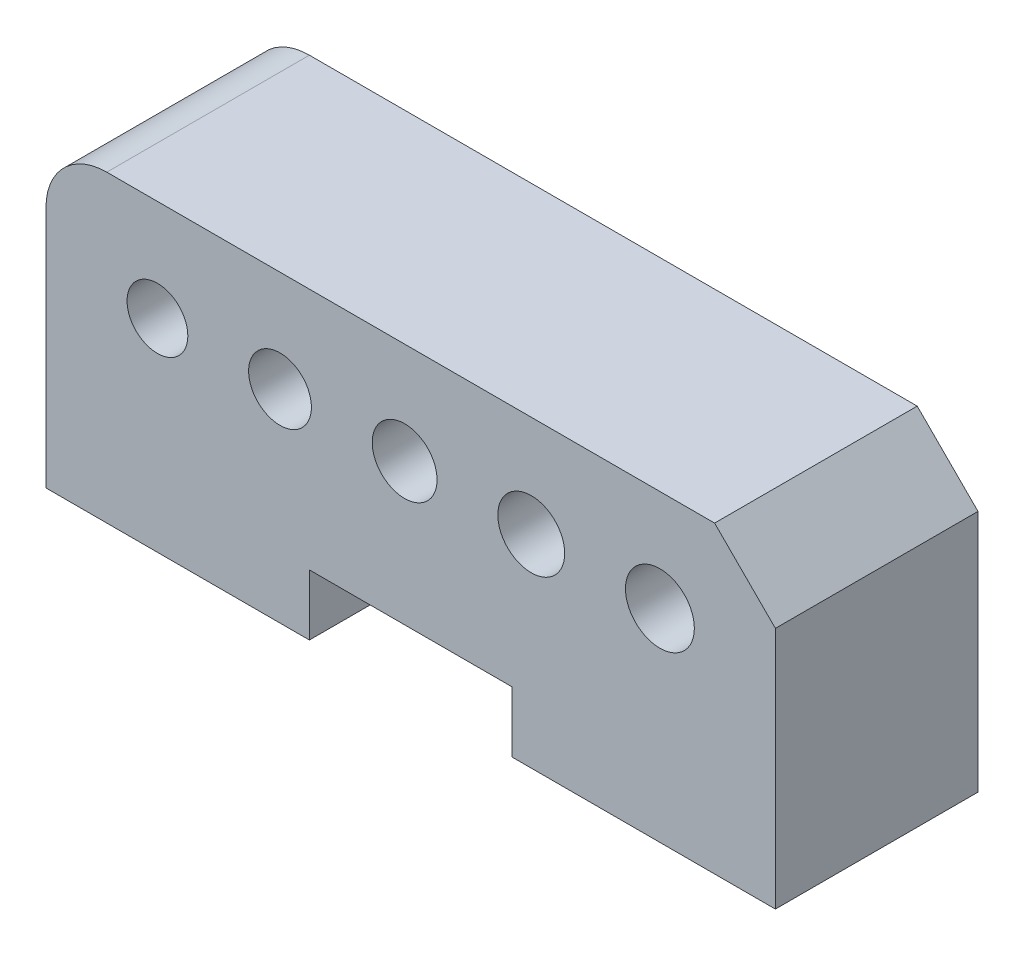
ISO-10303-21;
HEADER;
FILE_DESCRIPTION(('STEP AP214'),'2;1');
FILE_NAME('part.step','',(''),(''),'','','');
FILE_SCHEMA(('AUTOMOTIVE_DESIGN { 1 0 10303 214 1 1 1 1 }'));
ENDSEC;
DATA;
#1=APPLICATION_CONTEXT('core data for automotive mechanical design processes');
#2=APPLICATION_PROTOCOL_DEFINITION('international standard','automotive_design',2000,#1);
#3=PRODUCT_CONTEXT('',#1,'mechanical');
#4=PRODUCT('Part','Part','',(#3));
#5=PRODUCT_RELATED_PRODUCT_CATEGORY('part','',(#4));
#6=PRODUCT_DEFINITION_FORMATION('','',#4);
#7=PRODUCT_DEFINITION_CONTEXT('part definition',#1,'design');
#8=PRODUCT_DEFINITION('design','',#6,#7);
#9=PRODUCT_DEFINITION_SHAPE('','',#8);
#10=(LENGTH_UNIT() NAMED_UNIT(*) SI_UNIT(.MILLI.,.METRE.));
#11=(NAMED_UNIT(*) PLANE_ANGLE_UNIT() SI_UNIT($,.RADIAN.));
#12=(NAMED_UNIT(*) SI_UNIT($,.STERADIAN.) SOLID_ANGLE_UNIT());
#13=UNCERTAINTY_MEASURE_WITH_UNIT(LENGTH_MEASURE(1.E-05),#10,'distance_accuracy_value','');
#14=(GEOMETRIC_REPRESENTATION_CONTEXT(3) GLOBAL_UNCERTAINTY_ASSIGNED_CONTEXT((#13)) GLOBAL_UNIT_ASSIGNED_CONTEXT((#10,
#11,#12)) REPRESENTATION_CONTEXT('',''));
#15=CARTESIAN_POINT('',(0.,0.,0.));
#16=DIRECTION('',(0.,0.,1.));
#17=DIRECTION('',(1.,0.,0.));
#18=AXIS2_PLACEMENT_3D('',#15,#16,#17);
#19=CARTESIAN_POINT('',(0.,-10.,10.));
#20=DIRECTION('',(0.,-1.,0.));
#21=DIRECTION('',(1.,0.,0.));
#22=AXIS2_PLACEMENT_3D('',#19,#20,#21);
#23=PLANE('',#22);
#24=DIRECTION('',(0.,0.,1.));
#25=VECTOR('',#24,1.);
#26=CARTESIAN_POINT('',(5.,-10.,10.));
#27=LINE('',#26,#25);
#28=CARTESIAN_POINT('',(5.,-10.,0.));
#29=VERTEX_POINT('',#28);
#30=CARTESIAN_POINT('',(5.,-10.,10.));
#31=VERTEX_POINT('',#30);
#32=EDGE_CURVE('E200',#29,#31,#27,.T.);
#33=ORIENTED_EDGE('',*,*,#32,.F.);
#34=DIRECTION('',(-1.,0.,0.));
#35=VECTOR('',#34,1.);
#36=CARTESIAN_POINT('',(0.,-10.,0.));
#37=LINE('',#36,#35);
#38=CARTESIAN_POINT('',(18.,-10.,0.));
#39=VERTEX_POINT('',#38);
#40=EDGE_CURVE('E135',#39,#29,#37,.T.);
#41=ORIENTED_EDGE('',*,*,#40,.F.);
#42=DIRECTION('',(0.,0.,-1.));
#43=VECTOR('',#42,1.);
#44=CARTESIAN_POINT('',(18.,-10.,10.));
#45=LINE('',#44,#43);
#46=CARTESIAN_POINT('',(18.,-10.,10.));
#47=VERTEX_POINT('',#46);
#48=EDGE_CURVE('E148',#47,#39,#45,.T.);
#49=ORIENTED_EDGE('',*,*,#48,.F.);
#50=DIRECTION('',(-1.,0.,0.));
#51=VECTOR('',#50,1.);
#52=CARTESIAN_POINT('',(0.,-10.,10.));
#53=LINE('',#52,#51);
#54=EDGE_CURVE('E190',#47,#31,#53,.T.);
#55=ORIENTED_EDGE('',*,*,#54,.T.);
#56=EDGE_LOOP('',(#33,#41,#49,#55));
#57=FACE_BOUND('',#56,.T.);
#58=ADVANCED_FACE('F37',(#57),#23,.T.);
#59=CARTESIAN_POINT('',(0.,5.,10.));
#60=DIRECTION('',(0.,-1.,0.));
#61=DIRECTION('',(0.,0.,-1.));
#62=AXIS2_PLACEMENT_3D('',#59,#60,#61);
#63=PLANE('',#62);
#64=DIRECTION('',(-1.,0.,0.));
#65=VECTOR('',#64,1.);
#66=CARTESIAN_POINT('',(0.,5.,10.));
#67=LINE('',#66,#65);
#68=CARTESIAN_POINT('',(15.,5.,10.));
#69=VERTEX_POINT('',#68);
#70=CARTESIAN_POINT('',(-15.,5.,10.));
#71=VERTEX_POINT('',#70);
#72=EDGE_CURVE('E175',#69,#71,#67,.T.);
#73=ORIENTED_EDGE('',*,*,#72,.F.);
#74=DIRECTION('',(0.,0.,-1.));
#75=VECTOR('',#74,1.);
#76=CARTESIAN_POINT('',(15.,5.,0.));
#77=LINE('',#76,#75);
#78=CARTESIAN_POINT('',(15.,5.,0.));
#79=VERTEX_POINT('',#78);
#80=EDGE_CURVE('E165',#69,#79,#77,.T.);
#81=ORIENTED_EDGE('',*,*,#80,.T.);
#82=DIRECTION('',(-1.,0.,0.));
#83=VECTOR('',#82,1.);
#84=CARTESIAN_POINT('',(0.,5.,0.));
#85=LINE('',#84,#83);
#86=CARTESIAN_POINT('',(-15.,5.,0.));
#87=VERTEX_POINT('',#86);
#88=EDGE_CURVE('E187',#79,#87,#85,.T.);
#89=ORIENTED_EDGE('',*,*,#88,.T.);
#90=DIRECTION('',(0.,0.,-1.));
#91=VECTOR('',#90,1.);
#92=CARTESIAN_POINT('',(-15.,5.,10.));
#93=LINE('',#92,#91);
#94=EDGE_CURVE('E160',#87,#71,#93,.F.);
#95=ORIENTED_EDGE('',*,*,#94,.T.);
#96=EDGE_LOOP('',(#73,#81,#89,#95));
#97=FACE_BOUND('',#96,.T.);
#98=ADVANCED_FACE('F180',(#97),#63,.F.);
#99=CARTESIAN_POINT('',(-18.,0.,10.));
#100=DIRECTION('',(1.,0.,0.));
#101=DIRECTION('',(0.,0.,-1.));
#102=AXIS2_PLACEMENT_3D('',#99,#100,#101);
#103=PLANE('',#102);
#104=DIRECTION('',(0.,-1.,0.));
#105=VECTOR('',#104,1.);
#106=CARTESIAN_POINT('',(-18.,0.,10.));
#107=LINE('',#106,#105);
#108=CARTESIAN_POINT('',(-18.,2.,10.));
#109=VERTEX_POINT('',#108);
#110=CARTESIAN_POINT('',(-18.,-10.,10.));
#111=VERTEX_POINT('',#110);
#112=EDGE_CURVE('E184',#109,#111,#107,.T.);
#113=ORIENTED_EDGE('',*,*,#112,.F.);
#114=DIRECTION('',(0.,0.,-1.));
#115=VECTOR('',#114,1.);
#116=CARTESIAN_POINT('',(-18.,2.,10.));
#117=LINE('',#116,#115);
#118=CARTESIAN_POINT('',(-18.,2.,0.));
#119=VERTEX_POINT('',#118);
#120=EDGE_CURVE('E154',#109,#119,#117,.T.);
#121=ORIENTED_EDGE('',*,*,#120,.T.);
#122=DIRECTION('',(0.,-1.,0.));
#123=VECTOR('',#122,1.);
#124=CARTESIAN_POINT('',(-18.,0.,0.));
#125=LINE('',#124,#123);
#126=CARTESIAN_POINT('',(-18.,-10.,0.));
#127=VERTEX_POINT('',#126);
#128=EDGE_CURVE('E144',#119,#127,#125,.T.);
#129=ORIENTED_EDGE('',*,*,#128,.T.);
#130=DIRECTION('',(0.,0.,-1.));
#131=VECTOR('',#130,1.);
#132=CARTESIAN_POINT('',(-18.,-10.,10.));
#133=LINE('',#132,#131);
#134=EDGE_CURVE('E150',#111,#127,#133,.T.);
#135=ORIENTED_EDGE('',*,*,#134,.F.);
#136=EDGE_LOOP('',(#113,#121,#129,#135));
#137=FACE_BOUND('',#136,.T.);
#138=ADVANCED_FACE('F216',(#137),#103,.F.);
#139=DIRECTION('',(0.,0.,-1.));
#140=VECTOR('',#139,1.);
#141=CARTESIAN_POINT('',(-5.,-10.,10.));
#142=LINE('',#141,#140);
#143=CARTESIAN_POINT('',(-5.,-10.,10.));
#144=VERTEX_POINT('',#143);
#145=CARTESIAN_POINT('',(-5.,-10.,0.));
#146=VERTEX_POINT('',#145);
#147=EDGE_CURVE('E224',#144,#146,#142,.T.);
#148=ORIENTED_EDGE('',*,*,#147,.F.);
#149=EDGE_CURVE('E191',#144,#111,#53,.T.);
#150=ORIENTED_EDGE('',*,*,#149,.T.);
#151=ORIENTED_EDGE('',*,*,#134,.T.);
#152=EDGE_CURVE('E140',#146,#127,#37,.T.);
#153=ORIENTED_EDGE('',*,*,#152,.F.);
#154=EDGE_LOOP('',(#148,#150,#151,#153));
#155=FACE_BOUND('',#154,.T.);
#156=ADVANCED_FACE('F221',(#155),#23,.T.);
#157=CARTESIAN_POINT('',(-6.45,0.,10.));
#158=DIRECTION('',(0.,0.,-1.));
#159=DIRECTION('',(-1.,0.,0.));
#160=AXIS2_PLACEMENT_3D('',#157,#158,#159);
#161=CYLINDRICAL_SURFACE('',#160,1.55);
#162=CARTESIAN_POINT('',(-6.45,0.,10.));
#163=DIRECTION('',(0.,0.,1.));
#164=DIRECTION('',(1.,0.,0.));
#165=AXIS2_PLACEMENT_3D('',#162,#163,#164);
#166=CIRCLE('',#165,1.55);
#167=CARTESIAN_POINT('',(-4.9,0.,10.));
#168=VERTEX_POINT('',#167);
#169=EDGE_CURVE('E185',#168,#168,#166,.T.);
#170=ORIENTED_EDGE('',*,*,#169,.T.);
#171=EDGE_LOOP('',(#170));
#172=FACE_BOUND('',#171,.T.);
#173=CARTESIAN_POINT('',(-6.45,0.,0.));
#174=DIRECTION('',(0.,0.,1.));
#175=DIRECTION('',(1.,0.,0.));
#176=AXIS2_PLACEMENT_3D('',#173,#174,#175);
#177=CIRCLE('',#176,1.55);
#178=CARTESIAN_POINT('',(-4.9,0.,0.));
#179=VERTEX_POINT('',#178);
#180=EDGE_CURVE('E209',#179,#179,#177,.T.);
#181=ORIENTED_EDGE('',*,*,#180,.F.);
#182=EDGE_LOOP('',(#181));
#183=FACE_BOUND('',#182,.T.);
#184=ADVANCED_FACE('F244',(#172,#183),#161,.F.);
#185=CARTESIAN_POINT('',(-12.5,0.,10.));
#186=DIRECTION('',(0.,0.,-1.));
#187=DIRECTION('',(-1.,0.,0.));
#188=AXIS2_PLACEMENT_3D('',#185,#186,#187);
#189=CYLINDRICAL_SURFACE('',#188,1.5);
#190=CARTESIAN_POINT('',(-12.5,0.,10.));
#191=DIRECTION('',(0.,0.,1.));
#192=DIRECTION('',(1.,0.,0.));
#193=AXIS2_PLACEMENT_3D('',#190,#191,#192);
#194=CIRCLE('',#193,1.5);
#195=CARTESIAN_POINT('',(-11.,0.,10.));
#196=VERTEX_POINT('',#195);
#197=EDGE_CURVE('E297',#196,#196,#194,.T.);
#198=ORIENTED_EDGE('',*,*,#197,.T.);
#199=EDGE_LOOP('',(#198));
#200=FACE_BOUND('',#199,.T.);
#201=CARTESIAN_POINT('',(-12.5,0.,0.));
#202=DIRECTION('',(0.,0.,1.));
#203=DIRECTION('',(1.,0.,0.));
#204=AXIS2_PLACEMENT_3D('',#201,#202,#203);
#205=CIRCLE('',#204,1.5);
#206=CARTESIAN_POINT('',(-11.,0.,0.));
#207=VERTEX_POINT('',#206);
#208=EDGE_CURVE('E206',#207,#207,#205,.T.);
#209=ORIENTED_EDGE('',*,*,#208,.F.);
#210=EDGE_LOOP('',(#209));
#211=FACE_BOUND('',#210,.T.);
#212=ADVANCED_FACE('F249',(#200,#211),#189,.F.);
#213=CARTESIAN_POINT('',(-0.299999999999996,0.,10.));
#214=DIRECTION('',(0.,0.,-1.));
#215=DIRECTION('',(-1.,0.,0.));
#216=AXIS2_PLACEMENT_3D('',#213,#214,#215);
#217=CYLINDRICAL_SURFACE('',#216,1.6);
#218=CARTESIAN_POINT('',(-0.299999999999996,0.,10.));
#219=DIRECTION('',(0.,0.,1.));
#220=DIRECTION('',(1.,0.,0.));
#221=AXIS2_PLACEMENT_3D('',#218,#219,#220);
#222=CIRCLE('',#221,1.6);
#223=CARTESIAN_POINT('',(1.3,0.,10.));
#224=VERTEX_POINT('',#223);
#225=EDGE_CURVE('E290',#224,#224,#222,.T.);
#226=ORIENTED_EDGE('',*,*,#225,.T.);
#227=EDGE_LOOP('',(#226));
#228=FACE_BOUND('',#227,.T.);
#229=CARTESIAN_POINT('',(-0.299999999999996,0.,0.));
#230=DIRECTION('',(0.,0.,1.));
#231=DIRECTION('',(1.,0.,0.));
#232=AXIS2_PLACEMENT_3D('',#229,#230,#231);
#233=CIRCLE('',#232,1.6);
#234=CARTESIAN_POINT('',(1.3,0.,0.));
#235=VERTEX_POINT('',#234);
#236=EDGE_CURVE('E203',#235,#235,#233,.T.);
#237=ORIENTED_EDGE('',*,*,#236,.F.);
#238=EDGE_LOOP('',(#237));
#239=FACE_BOUND('',#238,.T.);
#240=ADVANCED_FACE('F257',(#228,#239),#217,.F.);
#241=CARTESIAN_POINT('',(5.95,0.,10.));
#242=DIRECTION('',(0.,0.,-1.));
#243=DIRECTION('',(-1.,0.,0.));
#244=AXIS2_PLACEMENT_3D('',#241,#242,#243);
#245=CYLINDRICAL_SURFACE('',#244,1.65);
#246=CARTESIAN_POINT('',(5.95,0.,10.));
#247=DIRECTION('',(0.,0.,1.));
#248=DIRECTION('',(1.,0.,0.));
#249=AXIS2_PLACEMENT_3D('',#246,#247,#248);
#250=CIRCLE('',#249,1.65);
#251=CARTESIAN_POINT('',(7.6,0.,10.));
#252=VERTEX_POINT('',#251);
#253=EDGE_CURVE('E287',#252,#252,#250,.T.);
#254=ORIENTED_EDGE('',*,*,#253,.T.);
#255=EDGE_LOOP('',(#254));
#256=FACE_BOUND('',#255,.T.);
#257=CARTESIAN_POINT('',(5.95,0.,0.));
#258=DIRECTION('',(0.,0.,1.));
#259=DIRECTION('',(1.,0.,0.));
#260=AXIS2_PLACEMENT_3D('',#257,#258,#259);
#261=CIRCLE('',#260,1.65);
#262=CARTESIAN_POINT('',(7.6,0.,0.));
#263=VERTEX_POINT('',#262);
#264=EDGE_CURVE('E199',#263,#263,#261,.T.);
#265=ORIENTED_EDGE('',*,*,#264,.F.);
#266=EDGE_LOOP('',(#265));
#267=FACE_BOUND('',#266,.T.);
#268=ADVANCED_FACE('F261',(#256,#267),#245,.F.);
#269=CARTESIAN_POINT('',(12.3,0.,10.));
#270=DIRECTION('',(0.,0.,-1.));
#271=DIRECTION('',(-1.,0.,0.));
#272=AXIS2_PLACEMENT_3D('',#269,#270,#271);
#273=CYLINDRICAL_SURFACE('',#272,1.7);
#274=CARTESIAN_POINT('',(12.3,0.,10.));
#275=DIRECTION('',(0.,0.,1.));
#276=DIRECTION('',(1.,0.,0.));
#277=AXIS2_PLACEMENT_3D('',#274,#275,#276);
#278=CIRCLE('',#277,1.7);
#279=CARTESIAN_POINT('',(14.,0.,10.));
#280=VERTEX_POINT('',#279);
#281=EDGE_CURVE('E142',#280,#280,#278,.T.);
#282=ORIENTED_EDGE('',*,*,#281,.T.);
#283=EDGE_LOOP('',(#282));
#284=FACE_BOUND('',#283,.T.);
#285=CARTESIAN_POINT('',(12.3,0.,0.));
#286=DIRECTION('',(0.,0.,1.));
#287=DIRECTION('',(1.,0.,0.));
#288=AXIS2_PLACEMENT_3D('',#285,#286,#287);
#289=CIRCLE('',#288,1.7);
#290=CARTESIAN_POINT('',(14.,0.,0.));
#291=VERTEX_POINT('',#290);
#292=EDGE_CURVE('E196',#291,#291,#289,.T.);
#293=ORIENTED_EDGE('',*,*,#292,.F.);
#294=EDGE_LOOP('',(#293));
#295=FACE_BOUND('',#294,.T.);
#296=ADVANCED_FACE('F264',(#284,#295),#273,.F.);
#297=CARTESIAN_POINT('',(18.,0.,10.));
#298=DIRECTION('',(1.,0.,0.));
#299=DIRECTION('',(0.,1.,0.));
#300=AXIS2_PLACEMENT_3D('',#297,#298,#299);
#301=PLANE('',#300);
#302=DIRECTION('',(0.,-1.,0.));
#303=VECTOR('',#302,1.);
#304=CARTESIAN_POINT('',(18.,0.,0.));
#305=LINE('',#304,#303);
#306=CARTESIAN_POINT('',(18.,1.99999999999999,0.));
#307=VERTEX_POINT('',#306);
#308=EDGE_CURVE('E136',#307,#39,#305,.T.);
#309=ORIENTED_EDGE('',*,*,#308,.F.);
#310=DIRECTION('',(0.,0.,1.));
#311=VECTOR('',#310,1.);
#312=CARTESIAN_POINT('',(18.,1.99999999999999,10.));
#313=LINE('',#312,#311);
#314=CARTESIAN_POINT('',(18.,1.99999999999999,10.));
#315=VERTEX_POINT('',#314);
#316=EDGE_CURVE('E60',#307,#315,#313,.T.);
#317=ORIENTED_EDGE('',*,*,#316,.T.);
#318=DIRECTION('',(0.,-1.,0.));
#319=VECTOR('',#318,1.);
#320=CARTESIAN_POINT('',(18.,0.,10.));
#321=LINE('',#320,#319);
#322=EDGE_CURVE('E151',#315,#47,#321,.T.);
#323=ORIENTED_EDGE('',*,*,#322,.T.);
#324=ORIENTED_EDGE('',*,*,#48,.T.);
#325=EDGE_LOOP('',(#309,#317,#323,#324));
#326=FACE_BOUND('',#325,.T.);
#327=ADVANCED_FACE('F188',(#326),#301,.T.);
#328=CARTESIAN_POINT('',(0.,0.,10.));
#329=DIRECTION('',(0.,0.,1.));
#330=DIRECTION('',(1.,0.,0.));
#331=AXIS2_PLACEMENT_3D('',#328,#329,#330);
#332=PLANE('',#331);
#333=DIRECTION('',(0.,1.,0.));
#334=VECTOR('',#333,1.);
#335=CARTESIAN_POINT('',(5.,-13.,10.));
#336=LINE('',#335,#334);
#337=CARTESIAN_POINT('',(5.,-7.00000000000001,10.));
#338=VERTEX_POINT('',#337);
#339=EDGE_CURVE('E119',#31,#338,#336,.T.);
#340=ORIENTED_EDGE('',*,*,#339,.F.);
#341=ORIENTED_EDGE('',*,*,#54,.F.);
#342=ORIENTED_EDGE('',*,*,#322,.F.);
#343=DIRECTION('',(-0.707106781186546,0.707106781186549,0.));
#344=VECTOR('',#343,1.);
#345=CARTESIAN_POINT('',(10.,9.99999999999999,10.));
#346=LINE('',#345,#344);
#347=EDGE_CURVE('E45',#315,#69,#346,.T.);
#348=ORIENTED_EDGE('',*,*,#347,.T.);
#349=ORIENTED_EDGE('',*,*,#72,.T.);
#350=CARTESIAN_POINT('',(-15.,2.,10.));
#351=DIRECTION('',(0.,0.,1.));
#352=DIRECTION('',(1.,0.,0.));
#353=AXIS2_PLACEMENT_3D('',#350,#351,#352);
#354=CIRCLE('',#353,3.);
#355=EDGE_CURVE('E163',#71,#109,#354,.T.);
#356=ORIENTED_EDGE('',*,*,#355,.T.);
#357=ORIENTED_EDGE('',*,*,#112,.T.);
#358=ORIENTED_EDGE('',*,*,#149,.F.);
#359=DIRECTION('',(0.,-1.,0.));
#360=VECTOR('',#359,1.);
#361=CARTESIAN_POINT('',(-5.,-13.,10.));
#362=LINE('',#361,#360);
#363=CARTESIAN_POINT('',(-5.,-7.00000000000001,10.));
#364=VERTEX_POINT('',#363);
#365=EDGE_CURVE('E129',#364,#144,#362,.T.);
#366=ORIENTED_EDGE('',*,*,#365,.F.);
#367=DIRECTION('',(-1.,0.,0.));
#368=VECTOR('',#367,1.);
#369=CARTESIAN_POINT('',(-5.,-7.00000000000001,10.));
#370=LINE('',#369,#368);
#371=EDGE_CURVE('E319',#338,#364,#370,.T.);
#372=ORIENTED_EDGE('',*,*,#371,.F.);
#373=EDGE_LOOP('',(#340,#341,#342,#348,#349,#356,#357,#358,#366,#372));
#374=FACE_BOUND('',#373,.T.);
#375=ORIENTED_EDGE('',*,*,#281,.F.);
#376=EDGE_LOOP('',(#375));
#377=FACE_BOUND('',#376,.T.);
#378=ORIENTED_EDGE('',*,*,#253,.F.);
#379=EDGE_LOOP('',(#378));
#380=FACE_BOUND('',#379,.T.);
#381=ORIENTED_EDGE('',*,*,#225,.F.);
#382=EDGE_LOOP('',(#381));
#383=FACE_BOUND('',#382,.T.);
#384=ORIENTED_EDGE('',*,*,#197,.F.);
#385=EDGE_LOOP('',(#384));
#386=FACE_BOUND('',#385,.T.);
#387=ORIENTED_EDGE('',*,*,#169,.F.);
#388=EDGE_LOOP('',(#387));
#389=FACE_BOUND('',#388,.T.);
#390=ADVANCED_FACE('F173',(#374,#377,#380,#383,#386,#389),#332,.T.);
#391=CARTESIAN_POINT('',(0.,0.,0.));
#392=DIRECTION('',(0.,0.,1.));
#393=DIRECTION('',(1.,0.,0.));
#394=AXIS2_PLACEMENT_3D('',#391,#392,#393);
#395=PLANE('',#394);
#396=ORIENTED_EDGE('',*,*,#40,.T.);
#397=DIRECTION('',(0.,1.,0.));
#398=VECTOR('',#397,1.);
#399=CARTESIAN_POINT('',(5.,0.,0.));
#400=LINE('',#399,#398);
#401=CARTESIAN_POINT('',(5.,-7.00000000000001,0.));
#402=VERTEX_POINT('',#401);
#403=EDGE_CURVE('E11',#29,#402,#400,.T.);
#404=ORIENTED_EDGE('',*,*,#403,.T.);
#405=DIRECTION('',(-1.,0.,0.));
#406=VECTOR('',#405,1.);
#407=CARTESIAN_POINT('',(-5.,-7.00000000000001,0.));
#408=LINE('',#407,#406);
#409=CARTESIAN_POINT('',(-5.,-7.00000000000001,0.));
#410=VERTEX_POINT('',#409);
#411=EDGE_CURVE('E126',#402,#410,#408,.T.);
#412=ORIENTED_EDGE('',*,*,#411,.T.);
#413=DIRECTION('',(0.,-1.,0.));
#414=VECTOR('',#413,1.);
#415=CARTESIAN_POINT('',(-5.,-13.,0.));
#416=LINE('',#415,#414);
#417=EDGE_CURVE('E52',#410,#146,#416,.T.);
#418=ORIENTED_EDGE('',*,*,#417,.T.);
#419=ORIENTED_EDGE('',*,*,#152,.T.);
#420=ORIENTED_EDGE('',*,*,#128,.F.);
#421=CARTESIAN_POINT('',(-15.,2.,0.));
#422=DIRECTION('',(0.,0.,1.));
#423=DIRECTION('',(1.,0.,0.));
#424=AXIS2_PLACEMENT_3D('',#421,#422,#423);
#425=CIRCLE('',#424,3.);
#426=EDGE_CURVE('E157',#119,#87,#425,.F.);
#427=ORIENTED_EDGE('',*,*,#426,.T.);
#428=ORIENTED_EDGE('',*,*,#88,.F.);
#429=DIRECTION('',(0.707106781186546,-0.707106781186549,0.));
#430=VECTOR('',#429,1.);
#431=CARTESIAN_POINT('',(15.,5.,0.));
#432=LINE('',#431,#430);
#433=EDGE_CURVE('E168',#79,#307,#432,.T.);
#434=ORIENTED_EDGE('',*,*,#433,.T.);
#435=ORIENTED_EDGE('',*,*,#308,.T.);
#436=EDGE_LOOP('',(#396,#404,#412,#418,#419,#420,#427,#428,#434,#435));
#437=FACE_BOUND('',#436,.T.);
#438=ORIENTED_EDGE('',*,*,#292,.T.);
#439=EDGE_LOOP('',(#438));
#440=FACE_BOUND('',#439,.T.);
#441=ORIENTED_EDGE('',*,*,#264,.T.);
#442=EDGE_LOOP('',(#441));
#443=FACE_BOUND('',#442,.T.);
#444=ORIENTED_EDGE('',*,*,#236,.T.);
#445=EDGE_LOOP('',(#444));
#446=FACE_BOUND('',#445,.T.);
#447=ORIENTED_EDGE('',*,*,#208,.T.);
#448=EDGE_LOOP('',(#447));
#449=FACE_BOUND('',#448,.T.);
#450=ORIENTED_EDGE('',*,*,#180,.T.);
#451=EDGE_LOOP('',(#450));
#452=FACE_BOUND('',#451,.T.);
#453=ADVANCED_FACE('F132',(#437,#440,#443,#446,#449,#452),#395,.F.);
#454=CARTESIAN_POINT('',(-15.,2.,10.));
#455=DIRECTION('',(0.,0.,-1.));
#456=DIRECTION('',(-1.,0.,0.));
#457=AXIS2_PLACEMENT_3D('',#454,#455,#456);
#458=CYLINDRICAL_SURFACE('',#457,3.);
#459=ORIENTED_EDGE('',*,*,#355,.F.);
#460=ORIENTED_EDGE('',*,*,#94,.F.);
#461=ORIENTED_EDGE('',*,*,#426,.F.);
#462=ORIENTED_EDGE('',*,*,#120,.F.);
#463=EDGE_LOOP('',(#459,#460,#461,#462));
#464=FACE_BOUND('',#463,.T.);
#465=ADVANCED_FACE('F227',(#464),#458,.T.);
#466=CARTESIAN_POINT('',(15.,5.,10.));
#467=DIRECTION('',(0.707106781186549,0.707106781186546,0.));
#468=DIRECTION('',(0.,0.,1.));
#469=AXIS2_PLACEMENT_3D('',#466,#467,#468);
#470=PLANE('',#469);
#471=ORIENTED_EDGE('',*,*,#347,.F.);
#472=ORIENTED_EDGE('',*,*,#316,.F.);
#473=ORIENTED_EDGE('',*,*,#433,.F.);
#474=ORIENTED_EDGE('',*,*,#80,.F.);
#475=EDGE_LOOP('',(#471,#472,#473,#474));
#476=FACE_BOUND('',#475,.T.);
#477=ADVANCED_FACE('F39',(#476),#470,.T.);
#478=CARTESIAN_POINT('',(5.,-13.,0.));
#479=DIRECTION('',(1.,0.,0.));
#480=DIRECTION('',(0.,0.,-1.));
#481=AXIS2_PLACEMENT_3D('',#478,#479,#480);
#482=PLANE('',#481);
#483=ORIENTED_EDGE('',*,*,#32,.T.);
#484=ORIENTED_EDGE('',*,*,#339,.T.);
#485=DIRECTION('',(0.,0.,1.));
#486=VECTOR('',#485,1.);
#487=CARTESIAN_POINT('',(5.,-7.00000000000001,0.));
#488=LINE('',#487,#486);
#489=EDGE_CURVE('E114',#402,#338,#488,.T.);
#490=ORIENTED_EDGE('',*,*,#489,.F.);
#491=ORIENTED_EDGE('',*,*,#403,.F.);
#492=EDGE_LOOP('',(#483,#484,#490,#491));
#493=FACE_BOUND('',#492,.T.);
#494=ADVANCED_FACE('F116',(#493),#482,.F.);
#495=CARTESIAN_POINT('',(-5.,-13.,0.));
#496=DIRECTION('',(-1.,0.,0.));
#497=DIRECTION('',(0.,0.,1.));
#498=AXIS2_PLACEMENT_3D('',#495,#496,#497);
#499=PLANE('',#498);
#500=ORIENTED_EDGE('',*,*,#147,.T.);
#501=ORIENTED_EDGE('',*,*,#417,.F.);
#502=DIRECTION('',(0.,0.,1.));
#503=VECTOR('',#502,1.);
#504=CARTESIAN_POINT('',(-5.,-7.00000000000001,0.));
#505=LINE('',#504,#503);
#506=EDGE_CURVE('E123',#410,#364,#505,.T.);
#507=ORIENTED_EDGE('',*,*,#506,.T.);
#508=ORIENTED_EDGE('',*,*,#365,.T.);
#509=EDGE_LOOP('',(#500,#501,#507,#508));
#510=FACE_BOUND('',#509,.T.);
#511=ADVANCED_FACE('F310',(#510),#499,.F.);
#512=CARTESIAN_POINT('',(-5.,-7.00000000000001,0.));
#513=DIRECTION('',(0.,1.,0.));
#514=DIRECTION('',(0.,0.,1.));
#515=AXIS2_PLACEMENT_3D('',#512,#513,#514);
#516=PLANE('',#515);
#517=ORIENTED_EDGE('',*,*,#371,.T.);
#518=ORIENTED_EDGE('',*,*,#506,.F.);
#519=ORIENTED_EDGE('',*,*,#411,.F.);
#520=ORIENTED_EDGE('',*,*,#489,.T.);
#521=EDGE_LOOP('',(#517,#518,#519,#520));
#522=FACE_BOUND('',#521,.T.);
#523=ADVANCED_FACE('F127',(#522),#516,.F.);
#524=CLOSED_SHELL('',(#58,#98,#138,#156,#184,#212,#240,#268,#296,#327,#390,#453,#465,#477,#494,
#511,#523));
#525=MANIFOLD_SOLID_BREP('B2',#524);
#526=ADVANCED_BREP_SHAPE_REPRESENTATION('',(#18,#525),#14);
#527=SHAPE_DEFINITION_REPRESENTATION(#9,#526);
ENDSEC;
END-ISO-10303-21;
